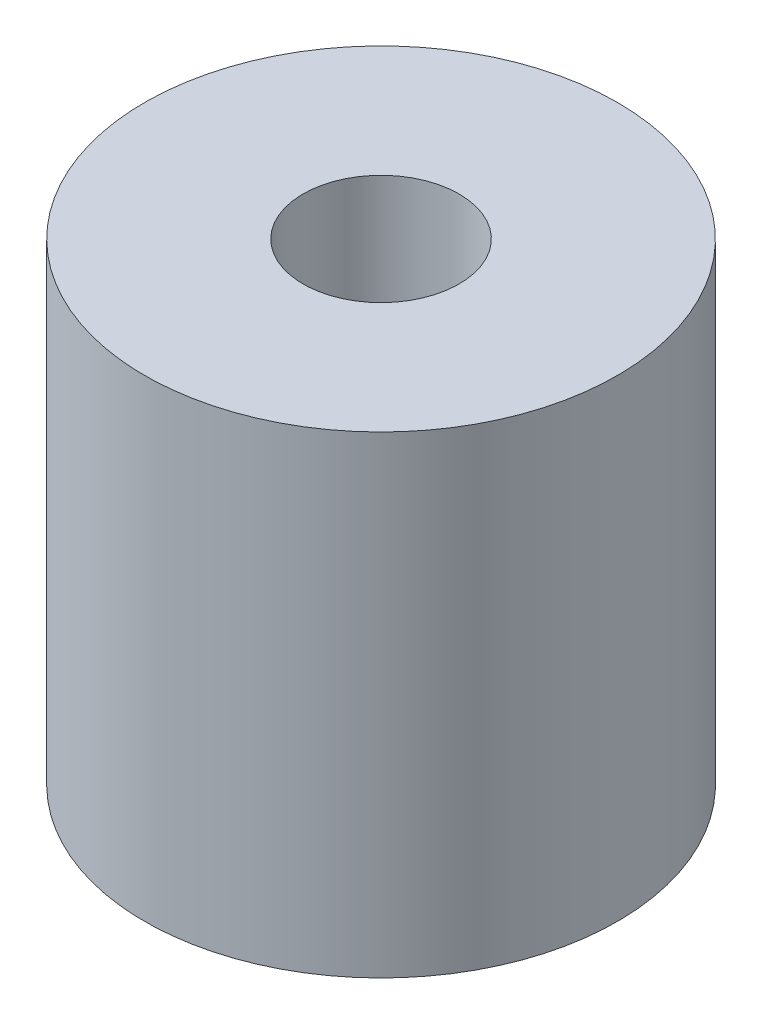
ISO-10303-21;
HEADER;
FILE_DESCRIPTION(('STEP AP214'),'2;1');
FILE_NAME('part.step','',(''),(''),'','','');
FILE_SCHEMA(('AUTOMOTIVE_DESIGN { 1 0 10303 214 1 1 1 1 }'));
ENDSEC;
DATA;
#1=APPLICATION_CONTEXT('core data for automotive mechanical design processes');
#2=APPLICATION_PROTOCOL_DEFINITION('international standard','automotive_design',2000,#1);
#3=PRODUCT_CONTEXT('',#1,'mechanical');
#4=PRODUCT('Part','Part','',(#3));
#5=PRODUCT_RELATED_PRODUCT_CATEGORY('part','',(#4));
#6=PRODUCT_DEFINITION_FORMATION('','',#4);
#7=PRODUCT_DEFINITION_CONTEXT('part definition',#1,'design');
#8=PRODUCT_DEFINITION('design','',#6,#7);
#9=PRODUCT_DEFINITION_SHAPE('','',#8);
#10=(LENGTH_UNIT() NAMED_UNIT(*) SI_UNIT(.MILLI.,.METRE.));
#11=(NAMED_UNIT(*) PLANE_ANGLE_UNIT() SI_UNIT($,.RADIAN.));
#12=(NAMED_UNIT(*) SI_UNIT($,.STERADIAN.) SOLID_ANGLE_UNIT());
#13=UNCERTAINTY_MEASURE_WITH_UNIT(LENGTH_MEASURE(1.E-05),#10,'distance_accuracy_value','');
#14=(GEOMETRIC_REPRESENTATION_CONTEXT(3) GLOBAL_UNCERTAINTY_ASSIGNED_CONTEXT((#13)) GLOBAL_UNIT_ASSIGNED_CONTEXT((#10,
#11,#12)) REPRESENTATION_CONTEXT('',''));
#15=CARTESIAN_POINT('',(0.,0.,0.));
#16=DIRECTION('',(0.,0.,1.));
#17=DIRECTION('',(1.,0.,0.));
#18=AXIS2_PLACEMENT_3D('',#15,#16,#17);
#19=CARTESIAN_POINT('',(0.,5.,0.));
#20=DIRECTION('',(0.,-1.,0.));
#21=DIRECTION('',(0.,0.,1.));
#22=AXIS2_PLACEMENT_3D('',#19,#20,#21);
#23=CYLINDRICAL_SURFACE('',#22,5.);
#24=CARTESIAN_POINT('',(0.,5.,0.));
#25=DIRECTION('',(0.,-1.,0.));
#26=DIRECTION('',(0.,0.,-1.));
#27=AXIS2_PLACEMENT_3D('',#24,#25,#26);
#28=CIRCLE('',#27,5.);
#29=CARTESIAN_POINT('',(0.,5.,-5.));
#30=VERTEX_POINT('',#29);
#31=EDGE_CURVE('E10',#30,#30,#28,.T.);
#32=ORIENTED_EDGE('',*,*,#31,.T.);
#33=EDGE_LOOP('',(#32));
#34=FACE_BOUND('',#33,.T.);
#35=CARTESIAN_POINT('',(0.,-5.,0.));
#36=DIRECTION('',(0.,-1.,0.));
#37=DIRECTION('',(0.,0.,-1.));
#38=AXIS2_PLACEMENT_3D('',#35,#36,#37);
#39=CIRCLE('',#38,5.);
#40=CARTESIAN_POINT('',(0.,-5.,-5.));
#41=VERTEX_POINT('',#40);
#42=EDGE_CURVE('E37',#41,#41,#39,.T.);
#43=ORIENTED_EDGE('',*,*,#42,.F.);
#44=EDGE_LOOP('',(#43));
#45=FACE_BOUND('',#44,.T.);
#46=ADVANCED_FACE('F34',(#34,#45),#23,.T.);
#47=CARTESIAN_POINT('',(0.,5.,0.));
#48=DIRECTION('',(0.,1.,0.));
#49=DIRECTION('',(0.,0.,-1.));
#50=AXIS2_PLACEMENT_3D('',#47,#48,#49);
#51=PLANE('',#50);
#52=CARTESIAN_POINT('',(0.,5.,0.));
#53=DIRECTION('',(0.,-1.,0.));
#54=DIRECTION('',(0.,0.,-1.));
#55=AXIS2_PLACEMENT_3D('',#52,#53,#54);
#56=CIRCLE('',#55,1.64999999999999);
#57=CARTESIAN_POINT('',(0.,5.,-1.64999999999999));
#58=VERTEX_POINT('',#57);
#59=EDGE_CURVE('E48',#58,#58,#56,.T.);
#60=ORIENTED_EDGE('',*,*,#59,.T.);
#61=EDGE_LOOP('',(#60));
#62=FACE_BOUND('',#61,.T.);
#63=ORIENTED_EDGE('',*,*,#31,.F.);
#64=EDGE_LOOP('',(#63));
#65=FACE_BOUND('',#64,.T.);
#66=ADVANCED_FACE('F52',(#62,#65),#51,.T.);
#67=CARTESIAN_POINT('',(0.,-5.,0.));
#68=DIRECTION('',(0.,1.,0.));
#69=DIRECTION('',(0.,0.,-1.));
#70=AXIS2_PLACEMENT_3D('',#67,#68,#69);
#71=PLANE('',#70);
#72=CARTESIAN_POINT('',(0.,-5.,0.));
#73=DIRECTION('',(0.,-1.,0.));
#74=DIRECTION('',(0.,0.,-1.));
#75=AXIS2_PLACEMENT_3D('',#72,#73,#74);
#76=CIRCLE('',#75,1.65);
#77=CARTESIAN_POINT('',(0.,-5.,-1.65));
#78=VERTEX_POINT('',#77);
#79=EDGE_CURVE('E44',#78,#78,#76,.T.);
#80=ORIENTED_EDGE('',*,*,#79,.F.);
#81=EDGE_LOOP('',(#80));
#82=FACE_BOUND('',#81,.T.);
#83=ORIENTED_EDGE('',*,*,#42,.T.);
#84=EDGE_LOOP('',(#83));
#85=FACE_BOUND('',#84,.T.);
#86=ADVANCED_FACE('F57',(#82,#85),#71,.F.);
#87=CARTESIAN_POINT('',(0.,5.,0.));
#88=DIRECTION('',(0.,1.,0.));
#89=DIRECTION('',(0.,0.,-1.));
#90=AXIS2_PLACEMENT_3D('',#87,#88,#89);
#91=CYLINDRICAL_SURFACE('',#90,1.64999999999999);
#92=ORIENTED_EDGE('',*,*,#79,.T.);
#93=EDGE_LOOP('',(#92));
#94=FACE_BOUND('',#93,.T.);
#95=ORIENTED_EDGE('',*,*,#59,.F.);
#96=EDGE_LOOP('',(#95));
#97=FACE_BOUND('',#96,.T.);
#98=ADVANCED_FACE('F55',(#94,#97),#91,.F.);
#99=CLOSED_SHELL('',(#46,#66,#86,#98));
#100=MANIFOLD_SOLID_BREP('B2',#99);
#101=ADVANCED_BREP_SHAPE_REPRESENTATION('',(#18,#100),#14);
#102=SHAPE_DEFINITION_REPRESENTATION(#9,#101);
ENDSEC;
END-ISO-10303-21;
